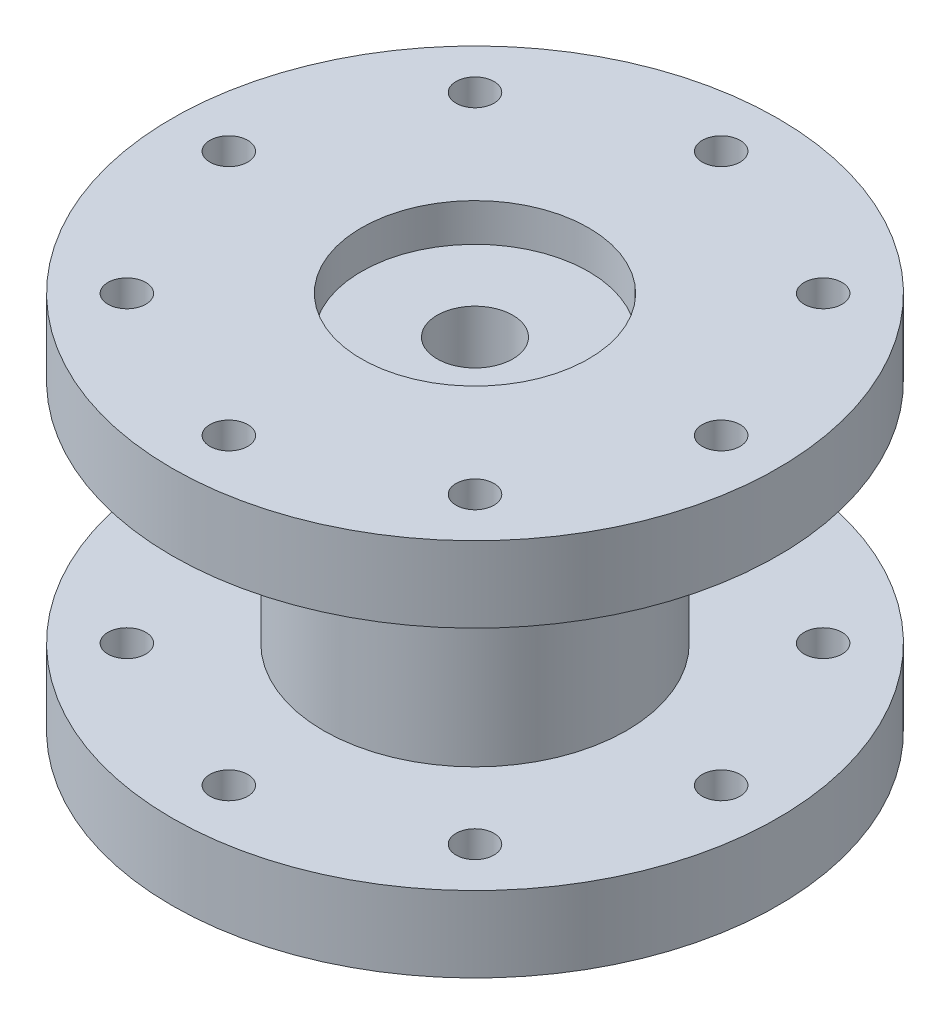
ISO-10303-21;
HEADER;
FILE_DESCRIPTION(('STEP AP214'),'2;1');
FILE_NAME('part.step','',(''),(''),'','','');
FILE_SCHEMA(('AUTOMOTIVE_DESIGN { 1 0 10303 214 1 1 1 1 }'));
ENDSEC;
DATA;
#1=APPLICATION_CONTEXT('core data for automotive mechanical design processes');
#2=APPLICATION_PROTOCOL_DEFINITION('international standard','automotive_design',2000,#1);
#3=PRODUCT_CONTEXT('',#1,'mechanical');
#4=PRODUCT('Part','Part','',(#3));
#5=PRODUCT_RELATED_PRODUCT_CATEGORY('part','',(#4));
#6=PRODUCT_DEFINITION_FORMATION('','',#4);
#7=PRODUCT_DEFINITION_CONTEXT('part definition',#1,'design');
#8=PRODUCT_DEFINITION('design','',#6,#7);
#9=PRODUCT_DEFINITION_SHAPE('','',#8);
#10=(LENGTH_UNIT() NAMED_UNIT(*) SI_UNIT(.MILLI.,.METRE.));
#11=(NAMED_UNIT(*) PLANE_ANGLE_UNIT() SI_UNIT($,.RADIAN.));
#12=(NAMED_UNIT(*) SI_UNIT($,.STERADIAN.) SOLID_ANGLE_UNIT());
#13=UNCERTAINTY_MEASURE_WITH_UNIT(LENGTH_MEASURE(1.E-05),#10,'distance_accuracy_value','');
#14=(GEOMETRIC_REPRESENTATION_CONTEXT(3) GLOBAL_UNCERTAINTY_ASSIGNED_CONTEXT((#13)) GLOBAL_UNIT_ASSIGNED_CONTEXT((#10,
#11,#12)) REPRESENTATION_CONTEXT('',''));
#15=CARTESIAN_POINT('',(0.,0.,0.));
#16=DIRECTION('',(0.,0.,1.));
#17=DIRECTION('',(1.,0.,0.));
#18=AXIS2_PLACEMENT_3D('',#15,#16,#17);
#19=CARTESIAN_POINT('',(0.,0.,0.));
#20=DIRECTION('',(0.,-1.,0.));
#21=DIRECTION('',(0.,0.,-1.));
#22=AXIS2_PLACEMENT_3D('',#19,#20,#21);
#23=CYLINDRICAL_SURFACE('',#22,19.05);
#24=CARTESIAN_POINT('',(0.,0.,0.));
#25=DIRECTION('',(0.,-1.,0.));
#26=DIRECTION('',(0.,0.,-1.));
#27=AXIS2_PLACEMENT_3D('',#24,#25,#26);
#28=CIRCLE('',#27,19.05);
#29=CARTESIAN_POINT('',(0.,0.,-19.05));
#30=VERTEX_POINT('',#29);
#31=EDGE_CURVE('E10',#30,#30,#28,.T.);
#32=ORIENTED_EDGE('',*,*,#31,.T.);
#33=EDGE_LOOP('',(#32));
#34=FACE_BOUND('',#33,.T.);
#35=CARTESIAN_POINT('',(0.,6.35,0.));
#36=DIRECTION('',(0.,-1.,0.));
#37=DIRECTION('',(0.,0.,-1.));
#38=AXIS2_PLACEMENT_3D('',#35,#36,#37);
#39=CIRCLE('',#38,19.05);
#40=CARTESIAN_POINT('',(0.,6.35,-19.05));
#41=VERTEX_POINT('',#40);
#42=EDGE_CURVE('E92',#41,#41,#39,.T.);
#43=ORIENTED_EDGE('',*,*,#42,.F.);
#44=EDGE_LOOP('',(#43));
#45=FACE_BOUND('',#44,.T.);
#46=ADVANCED_FACE('F41',(#34,#45),#23,.F.);
#47=CARTESIAN_POINT('',(19.05,0.,0.));
#48=DIRECTION('',(0.,-1.,0.));
#49=DIRECTION('',(0.,0.,-1.));
#50=AXIS2_PLACEMENT_3D('',#47,#48,#49);
#51=PLANE('',#50);
#52=CARTESIAN_POINT('',(41.275,0.,0.));
#53=DIRECTION('',(0.,1.,0.));
#54=DIRECTION('',(0.,0.,1.));
#55=AXIS2_PLACEMENT_3D('',#52,#53,#54);
#56=CIRCLE('',#55,3.175);
#57=CARTESIAN_POINT('',(41.275,0.,3.175));
#58=VERTEX_POINT('',#57);
#59=EDGE_CURVE('E160',#58,#58,#56,.T.);
#60=ORIENTED_EDGE('',*,*,#59,.T.);
#61=EDGE_LOOP('',(#60));
#62=FACE_BOUND('',#61,.T.);
#63=CARTESIAN_POINT('',(29.1858323934747,0.,29.1858323934748));
#64=DIRECTION('',(0.,1.,0.));
#65=DIRECTION('',(0.,0.,1.));
#66=AXIS2_PLACEMENT_3D('',#63,#64,#65);
#67=CIRCLE('',#66,3.175);
#68=CARTESIAN_POINT('',(29.1858323934747,0.,32.3608323934748));
#69=VERTEX_POINT('',#68);
#70=EDGE_CURVE('E209',#69,#69,#67,.T.);
#71=ORIENTED_EDGE('',*,*,#70,.T.);
#72=EDGE_LOOP('',(#71));
#73=FACE_BOUND('',#72,.T.);
#74=CARTESIAN_POINT('',(-1.4411089226075E-13,0.,41.275));
#75=DIRECTION('',(0.,1.,0.));
#76=DIRECTION('',(0.,0.,1.));
#77=AXIS2_PLACEMENT_3D('',#74,#75,#76);
#78=CIRCLE('',#77,3.17499999999999);
#79=CARTESIAN_POINT('',(-1.4411089226075E-13,0.,44.45));
#80=VERTEX_POINT('',#79);
#81=EDGE_CURVE('E201',#80,#80,#78,.T.);
#82=ORIENTED_EDGE('',*,*,#81,.T.);
#83=EDGE_LOOP('',(#82));
#84=FACE_BOUND('',#83,.T.);
#85=CARTESIAN_POINT('',(-29.1858323934749,0.,29.1858323934746));
#86=DIRECTION('',(0.,1.,0.));
#87=DIRECTION('',(0.,0.,1.));
#88=AXIS2_PLACEMENT_3D('',#85,#86,#87);
#89=CIRCLE('',#88,3.175);
#90=CARTESIAN_POINT('',(-29.1858323934749,0.,32.3608323934746));
#91=VERTEX_POINT('',#90);
#92=EDGE_CURVE('E193',#91,#91,#89,.T.);
#93=ORIENTED_EDGE('',*,*,#92,.T.);
#94=EDGE_LOOP('',(#93));
#95=FACE_BOUND('',#94,.T.);
#96=CARTESIAN_POINT('',(-41.275,0.,-2.88221784521501E-13));
#97=DIRECTION('',(0.,1.,0.));
#98=DIRECTION('',(0.,0.,1.));
#99=AXIS2_PLACEMENT_3D('',#96,#97,#98);
#100=CIRCLE('',#99,3.175);
#101=CARTESIAN_POINT('',(-41.275,0.,3.17499999999971));
#102=VERTEX_POINT('',#101);
#103=EDGE_CURVE('E185',#102,#102,#100,.T.);
#104=ORIENTED_EDGE('',*,*,#103,.T.);
#105=EDGE_LOOP('',(#104));
#106=FACE_BOUND('',#105,.T.);
#107=CARTESIAN_POINT('',(-29.1858323934745,0.,-29.185832393475));
#108=DIRECTION('',(0.,1.,0.));
#109=DIRECTION('',(0.,0.,1.));
#110=AXIS2_PLACEMENT_3D('',#107,#108,#109);
#111=CIRCLE('',#110,3.175);
#112=CARTESIAN_POINT('',(-29.1858323934745,0.,-26.010832393475));
#113=VERTEX_POINT('',#112);
#114=EDGE_CURVE('E177',#113,#113,#111,.T.);
#115=ORIENTED_EDGE('',*,*,#114,.T.);
#116=EDGE_LOOP('',(#115));
#117=FACE_BOUND('',#116,.T.);
#118=CARTESIAN_POINT('',(4.32332676782251E-13,0.,-41.275));
#119=DIRECTION('',(0.,1.,0.));
#120=DIRECTION('',(0.,0.,1.));
#121=AXIS2_PLACEMENT_3D('',#118,#119,#120);
#122=CIRCLE('',#121,3.17499999999999);
#123=CARTESIAN_POINT('',(4.32332676782251E-13,0.,-38.1));
#124=VERTEX_POINT('',#123);
#125=EDGE_CURVE('E169',#124,#124,#122,.T.);
#126=ORIENTED_EDGE('',*,*,#125,.T.);
#127=EDGE_LOOP('',(#126));
#128=FACE_BOUND('',#127,.T.);
#129=CARTESIAN_POINT('',(29.1858323934751,0.,-29.1858323934744));
#130=DIRECTION('',(0.,1.,0.));
#131=DIRECTION('',(0.,0.,1.));
#132=AXIS2_PLACEMENT_3D('',#129,#130,#131);
#133=CIRCLE('',#132,3.175);
#134=CARTESIAN_POINT('',(29.1858323934751,0.,-26.0108323934744));
#135=VERTEX_POINT('',#134);
#136=EDGE_CURVE('E161',#135,#135,#133,.T.);
#137=ORIENTED_EDGE('',*,*,#136,.T.);
#138=EDGE_LOOP('',(#137));
#139=FACE_BOUND('',#138,.T.);
#140=CARTESIAN_POINT('',(0.,0.,0.));
#141=DIRECTION('',(0.,-1.,0.));
#142=DIRECTION('',(0.,0.,-1.));
#143=AXIS2_PLACEMENT_3D('',#140,#141,#142);
#144=CIRCLE('',#143,50.8);
#145=CARTESIAN_POINT('',(0.,0.,-50.8));
#146=VERTEX_POINT('',#145);
#147=EDGE_CURVE('E48',#146,#146,#144,.T.);
#148=ORIENTED_EDGE('',*,*,#147,.T.);
#149=EDGE_LOOP('',(#148));
#150=FACE_BOUND('',#149,.T.);
#151=ORIENTED_EDGE('',*,*,#31,.F.);
#152=EDGE_LOOP('',(#151));
#153=FACE_BOUND('',#152,.T.);
#154=ADVANCED_FACE('F225',(#62,#73,#84,#95,#106,#117,#128,#139,#150,#153),#51,.T.);
#155=CARTESIAN_POINT('',(0.,0.,0.));
#156=DIRECTION('',(0.,-1.,0.));
#157=DIRECTION('',(0.,0.,-1.));
#158=AXIS2_PLACEMENT_3D('',#155,#156,#157);
#159=CYLINDRICAL_SURFACE('',#158,50.8);
#160=CARTESIAN_POINT('',(0.,12.7,0.));
#161=DIRECTION('',(0.,-1.,0.));
#162=DIRECTION('',(0.,0.,-1.));
#163=AXIS2_PLACEMENT_3D('',#160,#161,#162);
#164=CIRCLE('',#163,50.8);
#165=CARTESIAN_POINT('',(0.,12.7,-50.8));
#166=VERTEX_POINT('',#165);
#167=EDGE_CURVE('E53',#166,#166,#164,.T.);
#168=ORIENTED_EDGE('',*,*,#167,.T.);
#169=EDGE_LOOP('',(#168));
#170=FACE_BOUND('',#169,.T.);
#171=ORIENTED_EDGE('',*,*,#147,.F.);
#172=EDGE_LOOP('',(#171));
#173=FACE_BOUND('',#172,.T.);
#174=ADVANCED_FACE('F248',(#170,#173),#159,.T.);
#175=CARTESIAN_POINT('',(50.8,12.7,0.));
#176=DIRECTION('',(0.,1.,0.));
#177=DIRECTION('',(0.,0.,1.));
#178=AXIS2_PLACEMENT_3D('',#175,#176,#177);
#179=PLANE('',#178);
#180=CARTESIAN_POINT('',(41.275,12.7,0.));
#181=DIRECTION('',(0.,1.,0.));
#182=DIRECTION('',(0.,0.,1.));
#183=AXIS2_PLACEMENT_3D('',#180,#181,#182);
#184=CIRCLE('',#183,3.175);
#185=CARTESIAN_POINT('',(41.275,12.7,3.175));
#186=VERTEX_POINT('',#185);
#187=EDGE_CURVE('E96',#186,#186,#184,.T.);
#188=ORIENTED_EDGE('',*,*,#187,.F.);
#189=EDGE_LOOP('',(#188));
#190=FACE_BOUND('',#189,.T.);
#191=CARTESIAN_POINT('',(29.1858323934747,12.7,29.1858323934748));
#192=DIRECTION('',(0.,1.,0.));
#193=DIRECTION('',(0.,0.,1.));
#194=AXIS2_PLACEMENT_3D('',#191,#192,#193);
#195=CIRCLE('',#194,3.175);
#196=CARTESIAN_POINT('',(29.1858323934747,12.7,32.3608323934748));
#197=VERTEX_POINT('',#196);
#198=EDGE_CURVE('E104',#197,#197,#195,.T.);
#199=ORIENTED_EDGE('',*,*,#198,.F.);
#200=EDGE_LOOP('',(#199));
#201=FACE_BOUND('',#200,.T.);
#202=CARTESIAN_POINT('',(-1.4411089226075E-13,12.7,41.275));
#203=DIRECTION('',(0.,1.,0.));
#204=DIRECTION('',(0.,0.,1.));
#205=AXIS2_PLACEMENT_3D('',#202,#203,#204);
#206=CIRCLE('',#205,3.17499999999999);
#207=CARTESIAN_POINT('',(-1.4411089226075E-13,12.7,44.45));
#208=VERTEX_POINT('',#207);
#209=EDGE_CURVE('E112',#208,#208,#206,.T.);
#210=ORIENTED_EDGE('',*,*,#209,.F.);
#211=EDGE_LOOP('',(#210));
#212=FACE_BOUND('',#211,.T.);
#213=CARTESIAN_POINT('',(-29.1858323934749,12.7,29.1858323934746));
#214=DIRECTION('',(0.,1.,0.));
#215=DIRECTION('',(0.,0.,1.));
#216=AXIS2_PLACEMENT_3D('',#213,#214,#215);
#217=CIRCLE('',#216,3.175);
#218=CARTESIAN_POINT('',(-29.1858323934749,12.7,32.3608323934746));
#219=VERTEX_POINT('',#218);
#220=EDGE_CURVE('E120',#219,#219,#217,.T.);
#221=ORIENTED_EDGE('',*,*,#220,.F.);
#222=EDGE_LOOP('',(#221));
#223=FACE_BOUND('',#222,.T.);
#224=CARTESIAN_POINT('',(-41.275,12.7,-2.88221784521501E-13));
#225=DIRECTION('',(0.,1.,0.));
#226=DIRECTION('',(0.,0.,1.));
#227=AXIS2_PLACEMENT_3D('',#224,#225,#226);
#228=CIRCLE('',#227,3.175);
#229=CARTESIAN_POINT('',(-41.275,12.7,3.17499999999971));
#230=VERTEX_POINT('',#229);
#231=EDGE_CURVE('E128',#230,#230,#228,.T.);
#232=ORIENTED_EDGE('',*,*,#231,.F.);
#233=EDGE_LOOP('',(#232));
#234=FACE_BOUND('',#233,.T.);
#235=CARTESIAN_POINT('',(-29.1858323934745,12.7,-29.185832393475));
#236=DIRECTION('',(0.,1.,0.));
#237=DIRECTION('',(0.,0.,1.));
#238=AXIS2_PLACEMENT_3D('',#235,#236,#237);
#239=CIRCLE('',#238,3.175);
#240=CARTESIAN_POINT('',(-29.1858323934745,12.7,-26.010832393475));
#241=VERTEX_POINT('',#240);
#242=EDGE_CURVE('E136',#241,#241,#239,.T.);
#243=ORIENTED_EDGE('',*,*,#242,.F.);
#244=EDGE_LOOP('',(#243));
#245=FACE_BOUND('',#244,.T.);
#246=CARTESIAN_POINT('',(4.32332676782251E-13,12.7,-41.275));
#247=DIRECTION('',(0.,1.,0.));
#248=DIRECTION('',(0.,0.,1.));
#249=AXIS2_PLACEMENT_3D('',#246,#247,#248);
#250=CIRCLE('',#249,3.17499999999999);
#251=CARTESIAN_POINT('',(4.32332676782251E-13,12.7,-38.1));
#252=VERTEX_POINT('',#251);
#253=EDGE_CURVE('E144',#252,#252,#250,.T.);
#254=ORIENTED_EDGE('',*,*,#253,.F.);
#255=EDGE_LOOP('',(#254));
#256=FACE_BOUND('',#255,.T.);
#257=CARTESIAN_POINT('',(29.1858323934751,12.7,-29.1858323934744));
#258=DIRECTION('',(0.,1.,0.));
#259=DIRECTION('',(0.,0.,1.));
#260=AXIS2_PLACEMENT_3D('',#257,#258,#259);
#261=CIRCLE('',#260,3.175);
#262=CARTESIAN_POINT('',(29.1858323934751,12.7,-26.0108323934744));
#263=VERTEX_POINT('',#262);
#264=EDGE_CURVE('E152',#263,#263,#261,.T.);
#265=ORIENTED_EDGE('',*,*,#264,.F.);
#266=EDGE_LOOP('',(#265));
#267=FACE_BOUND('',#266,.T.);
#268=CARTESIAN_POINT('',(0.,12.7,0.));
#269=DIRECTION('',(0.,-1.,0.));
#270=DIRECTION('',(0.,0.,-1.));
#271=AXIS2_PLACEMENT_3D('',#268,#269,#270);
#272=CIRCLE('',#271,25.4);
#273=CARTESIAN_POINT('',(0.,12.7,-25.4));
#274=VERTEX_POINT('',#273);
#275=EDGE_CURVE('E58',#274,#274,#272,.T.);
#276=ORIENTED_EDGE('',*,*,#275,.T.);
#277=EDGE_LOOP('',(#276));
#278=FACE_BOUND('',#277,.T.);
#279=ORIENTED_EDGE('',*,*,#167,.F.);
#280=EDGE_LOOP('',(#279));
#281=FACE_BOUND('',#280,.T.);
#282=ADVANCED_FACE('F300',(#190,#201,#212,#223,#234,#245,#256,#267,#278,#281),#179,.T.);
#283=CARTESIAN_POINT('',(0.,0.,0.));
#284=DIRECTION('',(0.,-1.,0.));
#285=DIRECTION('',(0.,0.,-1.));
#286=AXIS2_PLACEMENT_3D('',#283,#284,#285);
#287=CYLINDRICAL_SURFACE('',#286,25.4);
#288=CARTESIAN_POINT('',(0.,50.8,0.));
#289=DIRECTION('',(0.,-1.,0.));
#290=DIRECTION('',(0.,0.,-1.));
#291=AXIS2_PLACEMENT_3D('',#288,#289,#290);
#292=CIRCLE('',#291,25.4);
#293=CARTESIAN_POINT('',(0.,50.8,-25.4));
#294=VERTEX_POINT('',#293);
#295=EDGE_CURVE('E64',#294,#294,#292,.T.);
#296=ORIENTED_EDGE('',*,*,#295,.T.);
#297=EDGE_LOOP('',(#296));
#298=FACE_BOUND('',#297,.T.);
#299=ORIENTED_EDGE('',*,*,#275,.F.);
#300=EDGE_LOOP('',(#299));
#301=FACE_BOUND('',#300,.T.);
#302=ADVANCED_FACE('F293',(#298,#301),#287,.T.);
#303=CARTESIAN_POINT('',(25.4,50.8,0.));
#304=DIRECTION('',(0.,-1.,0.));
#305=DIRECTION('',(0.,0.,-1.));
#306=AXIS2_PLACEMENT_3D('',#303,#304,#305);
#307=PLANE('',#306);
#308=CARTESIAN_POINT('',(41.275,50.8,0.));
#309=DIRECTION('',(0.,-1.,0.));
#310=DIRECTION('',(0.,0.,-1.));
#311=AXIS2_PLACEMENT_3D('',#308,#309,#310);
#312=CIRCLE('',#311,3.175);
#313=CARTESIAN_POINT('',(41.275,50.8,-3.175));
#314=VERTEX_POINT('',#313);
#315=EDGE_CURVE('E100',#314,#314,#312,.T.);
#316=ORIENTED_EDGE('',*,*,#315,.F.);
#317=EDGE_LOOP('',(#316));
#318=FACE_BOUND('',#317,.T.);
#319=CARTESIAN_POINT('',(29.1858323934747,50.8,29.1858323934748));
#320=DIRECTION('',(0.,-1.,0.));
#321=DIRECTION('',(0.,0.,-1.));
#322=AXIS2_PLACEMENT_3D('',#319,#320,#321);
#323=CIRCLE('',#322,3.175);
#324=CARTESIAN_POINT('',(29.1858323934747,50.8,26.0108323934748));
#325=VERTEX_POINT('',#324);
#326=EDGE_CURVE('E108',#325,#325,#323,.T.);
#327=ORIENTED_EDGE('',*,*,#326,.F.);
#328=EDGE_LOOP('',(#327));
#329=FACE_BOUND('',#328,.T.);
#330=CARTESIAN_POINT('',(-1.4411089226075E-13,50.8,41.275));
#331=DIRECTION('',(0.,-1.,0.));
#332=DIRECTION('',(0.,0.,-1.));
#333=AXIS2_PLACEMENT_3D('',#330,#331,#332);
#334=CIRCLE('',#333,3.17499999999999);
#335=CARTESIAN_POINT('',(-1.4411089226075E-13,50.8,38.1));
#336=VERTEX_POINT('',#335);
#337=EDGE_CURVE('E116',#336,#336,#334,.T.);
#338=ORIENTED_EDGE('',*,*,#337,.F.);
#339=EDGE_LOOP('',(#338));
#340=FACE_BOUND('',#339,.T.);
#341=CARTESIAN_POINT('',(-29.1858323934749,50.8,29.1858323934746));
#342=DIRECTION('',(0.,-1.,0.));
#343=DIRECTION('',(0.,0.,-1.));
#344=AXIS2_PLACEMENT_3D('',#341,#342,#343);
#345=CIRCLE('',#344,3.175);
#346=CARTESIAN_POINT('',(-29.1858323934749,50.8,26.0108323934746));
#347=VERTEX_POINT('',#346);
#348=EDGE_CURVE('E124',#347,#347,#345,.T.);
#349=ORIENTED_EDGE('',*,*,#348,.F.);
#350=EDGE_LOOP('',(#349));
#351=FACE_BOUND('',#350,.T.);
#352=CARTESIAN_POINT('',(-41.275,50.8,-2.88221784521501E-13));
#353=DIRECTION('',(0.,-1.,0.));
#354=DIRECTION('',(0.,0.,-1.));
#355=AXIS2_PLACEMENT_3D('',#352,#353,#354);
#356=CIRCLE('',#355,3.175);
#357=CARTESIAN_POINT('',(-41.275,50.8,-3.17500000000029));
#358=VERTEX_POINT('',#357);
#359=EDGE_CURVE('E132',#358,#358,#356,.T.);
#360=ORIENTED_EDGE('',*,*,#359,.F.);
#361=EDGE_LOOP('',(#360));
#362=FACE_BOUND('',#361,.T.);
#363=CARTESIAN_POINT('',(-29.1858323934745,50.8,-29.185832393475));
#364=DIRECTION('',(0.,-1.,0.));
#365=DIRECTION('',(0.,0.,-1.));
#366=AXIS2_PLACEMENT_3D('',#363,#364,#365);
#367=CIRCLE('',#366,3.175);
#368=CARTESIAN_POINT('',(-29.1858323934745,50.8,-32.360832393475));
#369=VERTEX_POINT('',#368);
#370=EDGE_CURVE('E140',#369,#369,#367,.T.);
#371=ORIENTED_EDGE('',*,*,#370,.F.);
#372=EDGE_LOOP('',(#371));
#373=FACE_BOUND('',#372,.T.);
#374=CARTESIAN_POINT('',(4.32332676782251E-13,50.8,-41.275));
#375=DIRECTION('',(0.,-1.,0.));
#376=DIRECTION('',(0.,0.,-1.));
#377=AXIS2_PLACEMENT_3D('',#374,#375,#376);
#378=CIRCLE('',#377,3.17499999999999);
#379=CARTESIAN_POINT('',(4.32332676782251E-13,50.8,-44.45));
#380=VERTEX_POINT('',#379);
#381=EDGE_CURVE('E148',#380,#380,#378,.T.);
#382=ORIENTED_EDGE('',*,*,#381,.F.);
#383=EDGE_LOOP('',(#382));
#384=FACE_BOUND('',#383,.T.);
#385=CARTESIAN_POINT('',(29.1858323934751,50.8,-29.1858323934744));
#386=DIRECTION('',(0.,-1.,0.));
#387=DIRECTION('',(0.,0.,-1.));
#388=AXIS2_PLACEMENT_3D('',#385,#386,#387);
#389=CIRCLE('',#388,3.175);
#390=CARTESIAN_POINT('',(29.1858323934751,50.8,-32.3608323934744));
#391=VERTEX_POINT('',#390);
#392=EDGE_CURVE('E156',#391,#391,#389,.T.);
#393=ORIENTED_EDGE('',*,*,#392,.F.);
#394=EDGE_LOOP('',(#393));
#395=FACE_BOUND('',#394,.T.);
#396=CARTESIAN_POINT('',(0.,50.8,0.));
#397=DIRECTION('',(0.,-1.,0.));
#398=DIRECTION('',(0.,0.,-1.));
#399=AXIS2_PLACEMENT_3D('',#396,#397,#398);
#400=CIRCLE('',#399,50.8);
#401=CARTESIAN_POINT('',(0.,50.8,-50.8));
#402=VERTEX_POINT('',#401);
#403=EDGE_CURVE('E68',#402,#402,#400,.T.);
#404=ORIENTED_EDGE('',*,*,#403,.T.);
#405=EDGE_LOOP('',(#404));
#406=FACE_BOUND('',#405,.T.);
#407=ORIENTED_EDGE('',*,*,#295,.F.);
#408=EDGE_LOOP('',(#407));
#409=FACE_BOUND('',#408,.T.);
#410=ADVANCED_FACE('F287',(#318,#329,#340,#351,#362,#373,#384,#395,#406,#409),#307,.T.);
#411=CARTESIAN_POINT('',(0.,0.,0.));
#412=DIRECTION('',(0.,-1.,0.));
#413=DIRECTION('',(0.,0.,-1.));
#414=AXIS2_PLACEMENT_3D('',#411,#412,#413);
#415=CYLINDRICAL_SURFACE('',#414,50.8);
#416=CARTESIAN_POINT('',(0.,63.5,0.));
#417=DIRECTION('',(0.,-1.,0.));
#418=DIRECTION('',(0.,0.,-1.));
#419=AXIS2_PLACEMENT_3D('',#416,#417,#418);
#420=CIRCLE('',#419,50.8);
#421=CARTESIAN_POINT('',(0.,63.5,-50.8));
#422=VERTEX_POINT('',#421);
#423=EDGE_CURVE('E72',#422,#422,#420,.T.);
#424=ORIENTED_EDGE('',*,*,#423,.T.);
#425=EDGE_LOOP('',(#424));
#426=FACE_BOUND('',#425,.T.);
#427=ORIENTED_EDGE('',*,*,#403,.F.);
#428=EDGE_LOOP('',(#427));
#429=FACE_BOUND('',#428,.T.);
#430=ADVANCED_FACE('F280',(#426,#429),#415,.T.);
#431=CARTESIAN_POINT('',(50.8,63.5,0.));
#432=DIRECTION('',(0.,1.,0.));
#433=DIRECTION('',(0.,0.,1.));
#434=AXIS2_PLACEMENT_3D('',#431,#432,#433);
#435=PLANE('',#434);
#436=CARTESIAN_POINT('',(41.275,63.5,0.));
#437=DIRECTION('',(0.,1.,0.));
#438=DIRECTION('',(0.,0.,1.));
#439=AXIS2_PLACEMENT_3D('',#436,#437,#438);
#440=CIRCLE('',#439,3.175);
#441=CARTESIAN_POINT('',(41.275,63.5,3.175));
#442=VERTEX_POINT('',#441);
#443=EDGE_CURVE('E217',#442,#442,#440,.T.);
#444=ORIENTED_EDGE('',*,*,#443,.F.);
#445=EDGE_LOOP('',(#444));
#446=FACE_BOUND('',#445,.T.);
#447=CARTESIAN_POINT('',(29.1858323934747,63.5,29.1858323934748));
#448=DIRECTION('',(0.,1.,0.));
#449=DIRECTION('',(0.,0.,1.));
#450=AXIS2_PLACEMENT_3D('',#447,#448,#449);
#451=CIRCLE('',#450,3.175);
#452=CARTESIAN_POINT('',(29.1858323934747,63.5,32.3608323934748));
#453=VERTEX_POINT('',#452);
#454=EDGE_CURVE('E213',#453,#453,#451,.T.);
#455=ORIENTED_EDGE('',*,*,#454,.F.);
#456=EDGE_LOOP('',(#455));
#457=FACE_BOUND('',#456,.T.);
#458=CARTESIAN_POINT('',(-1.4411089226075E-13,63.5,41.275));
#459=DIRECTION('',(0.,1.,0.));
#460=DIRECTION('',(0.,0.,1.));
#461=AXIS2_PLACEMENT_3D('',#458,#459,#460);
#462=CIRCLE('',#461,3.17499999999999);
#463=CARTESIAN_POINT('',(-1.4411089226075E-13,63.5,44.45));
#464=VERTEX_POINT('',#463);
#465=EDGE_CURVE('E205',#464,#464,#462,.T.);
#466=ORIENTED_EDGE('',*,*,#465,.F.);
#467=EDGE_LOOP('',(#466));
#468=FACE_BOUND('',#467,.T.);
#469=CARTESIAN_POINT('',(-29.1858323934749,63.5,29.1858323934746));
#470=DIRECTION('',(0.,1.,0.));
#471=DIRECTION('',(0.,0.,1.));
#472=AXIS2_PLACEMENT_3D('',#469,#470,#471);
#473=CIRCLE('',#472,3.175);
#474=CARTESIAN_POINT('',(-29.1858323934749,63.5,32.3608323934746));
#475=VERTEX_POINT('',#474);
#476=EDGE_CURVE('E197',#475,#475,#473,.T.);
#477=ORIENTED_EDGE('',*,*,#476,.F.);
#478=EDGE_LOOP('',(#477));
#479=FACE_BOUND('',#478,.T.);
#480=CARTESIAN_POINT('',(-41.275,63.5,-2.88221784521501E-13));
#481=DIRECTION('',(0.,1.,0.));
#482=DIRECTION('',(0.,0.,1.));
#483=AXIS2_PLACEMENT_3D('',#480,#481,#482);
#484=CIRCLE('',#483,3.175);
#485=CARTESIAN_POINT('',(-41.275,63.5,3.17499999999971));
#486=VERTEX_POINT('',#485);
#487=EDGE_CURVE('E189',#486,#486,#484,.T.);
#488=ORIENTED_EDGE('',*,*,#487,.F.);
#489=EDGE_LOOP('',(#488));
#490=FACE_BOUND('',#489,.T.);
#491=CARTESIAN_POINT('',(-29.1858323934745,63.5,-29.185832393475));
#492=DIRECTION('',(0.,1.,0.));
#493=DIRECTION('',(0.,0.,1.));
#494=AXIS2_PLACEMENT_3D('',#491,#492,#493);
#495=CIRCLE('',#494,3.175);
#496=CARTESIAN_POINT('',(-29.1858323934745,63.5,-26.010832393475));
#497=VERTEX_POINT('',#496);
#498=EDGE_CURVE('E181',#497,#497,#495,.T.);
#499=ORIENTED_EDGE('',*,*,#498,.F.);
#500=EDGE_LOOP('',(#499));
#501=FACE_BOUND('',#500,.T.);
#502=CARTESIAN_POINT('',(4.32332676782251E-13,63.5,-41.275));
#503=DIRECTION('',(0.,1.,0.));
#504=DIRECTION('',(0.,0.,1.));
#505=AXIS2_PLACEMENT_3D('',#502,#503,#504);
#506=CIRCLE('',#505,3.17499999999999);
#507=CARTESIAN_POINT('',(4.32332676782251E-13,63.5,-38.1));
#508=VERTEX_POINT('',#507);
#509=EDGE_CURVE('E173',#508,#508,#506,.T.);
#510=ORIENTED_EDGE('',*,*,#509,.F.);
#511=EDGE_LOOP('',(#510));
#512=FACE_BOUND('',#511,.T.);
#513=CARTESIAN_POINT('',(29.1858323934751,63.5,-29.1858323934744));
#514=DIRECTION('',(0.,1.,0.));
#515=DIRECTION('',(0.,0.,1.));
#516=AXIS2_PLACEMENT_3D('',#513,#514,#515);
#517=CIRCLE('',#516,3.175);
#518=CARTESIAN_POINT('',(29.1858323934751,63.5,-26.0108323934744));
#519=VERTEX_POINT('',#518);
#520=EDGE_CURVE('E165',#519,#519,#517,.T.);
#521=ORIENTED_EDGE('',*,*,#520,.F.);
#522=EDGE_LOOP('',(#521));
#523=FACE_BOUND('',#522,.T.);
#524=CARTESIAN_POINT('',(0.,63.5,0.));
#525=DIRECTION('',(0.,-1.,0.));
#526=DIRECTION('',(0.,0.,-1.));
#527=AXIS2_PLACEMENT_3D('',#524,#525,#526);
#528=CIRCLE('',#527,19.05);
#529=CARTESIAN_POINT('',(0.,63.5,-19.05));
#530=VERTEX_POINT('',#529);
#531=EDGE_CURVE('E76',#530,#530,#528,.T.);
#532=ORIENTED_EDGE('',*,*,#531,.T.);
#533=EDGE_LOOP('',(#532));
#534=FACE_BOUND('',#533,.T.);
#535=ORIENTED_EDGE('',*,*,#423,.F.);
#536=EDGE_LOOP('',(#535));
#537=FACE_BOUND('',#536,.T.);
#538=ADVANCED_FACE('F274',(#446,#457,#468,#479,#490,#501,#512,#523,#534,#537),#435,.T.);
#539=CARTESIAN_POINT('',(0.,0.,0.));
#540=DIRECTION('',(0.,-1.,0.));
#541=DIRECTION('',(0.,0.,-1.));
#542=AXIS2_PLACEMENT_3D('',#539,#540,#541);
#543=CYLINDRICAL_SURFACE('',#542,19.05);
#544=CARTESIAN_POINT('',(0.,57.15,0.));
#545=DIRECTION('',(0.,-1.,0.));
#546=DIRECTION('',(0.,0.,-1.));
#547=AXIS2_PLACEMENT_3D('',#544,#545,#546);
#548=CIRCLE('',#547,19.05);
#549=CARTESIAN_POINT('',(0.,57.15,-19.05));
#550=VERTEX_POINT('',#549);
#551=EDGE_CURVE('E80',#550,#550,#548,.T.);
#552=ORIENTED_EDGE('',*,*,#551,.T.);
#553=EDGE_LOOP('',(#552));
#554=FACE_BOUND('',#553,.T.);
#555=ORIENTED_EDGE('',*,*,#531,.F.);
#556=EDGE_LOOP('',(#555));
#557=FACE_BOUND('',#556,.T.);
#558=ADVANCED_FACE('F268',(#554,#557),#543,.F.);
#559=CARTESIAN_POINT('',(19.05,57.15,0.));
#560=DIRECTION('',(0.,1.,0.));
#561=DIRECTION('',(0.,0.,1.));
#562=AXIS2_PLACEMENT_3D('',#559,#560,#561);
#563=PLANE('',#562);
#564=CARTESIAN_POINT('',(0.,57.15,0.));
#565=DIRECTION('',(0.,-1.,0.));
#566=DIRECTION('',(0.,0.,-1.));
#567=AXIS2_PLACEMENT_3D('',#564,#565,#566);
#568=CIRCLE('',#567,6.35);
#569=CARTESIAN_POINT('',(0.,57.15,-6.35));
#570=VERTEX_POINT('',#569);
#571=EDGE_CURVE('E84',#570,#570,#568,.T.);
#572=ORIENTED_EDGE('',*,*,#571,.T.);
#573=EDGE_LOOP('',(#572));
#574=FACE_BOUND('',#573,.T.);
#575=ORIENTED_EDGE('',*,*,#551,.F.);
#576=EDGE_LOOP('',(#575));
#577=FACE_BOUND('',#576,.T.);
#578=ADVANCED_FACE('F262',(#574,#577),#563,.T.);
#579=CARTESIAN_POINT('',(0.,0.,0.));
#580=DIRECTION('',(0.,-1.,0.));
#581=DIRECTION('',(0.,0.,-1.));
#582=AXIS2_PLACEMENT_3D('',#579,#580,#581);
#583=CYLINDRICAL_SURFACE('',#582,6.35);
#584=CARTESIAN_POINT('',(0.,6.35,0.));
#585=DIRECTION('',(0.,-1.,0.));
#586=DIRECTION('',(0.,0.,-1.));
#587=AXIS2_PLACEMENT_3D('',#584,#585,#586);
#588=CIRCLE('',#587,6.35000000000001);
#589=CARTESIAN_POINT('',(0.,6.35,-6.35000000000001));
#590=VERTEX_POINT('',#589);
#591=EDGE_CURVE('E88',#590,#590,#588,.T.);
#592=ORIENTED_EDGE('',*,*,#591,.T.);
#593=EDGE_LOOP('',(#592));
#594=FACE_BOUND('',#593,.T.);
#595=ORIENTED_EDGE('',*,*,#571,.F.);
#596=EDGE_LOOP('',(#595));
#597=FACE_BOUND('',#596,.T.);
#598=ADVANCED_FACE('F256',(#594,#597),#583,.F.);
#599=CARTESIAN_POINT('',(6.35000000000001,6.35,0.));
#600=DIRECTION('',(0.,-1.,0.));
#601=DIRECTION('',(0.,0.,-1.));
#602=AXIS2_PLACEMENT_3D('',#599,#600,#601);
#603=PLANE('',#602);
#604=ORIENTED_EDGE('',*,*,#42,.T.);
#605=EDGE_LOOP('',(#604));
#606=FACE_BOUND('',#605,.T.);
#607=ORIENTED_EDGE('',*,*,#591,.F.);
#608=EDGE_LOOP('',(#607));
#609=FACE_BOUND('',#608,.T.);
#610=ADVANCED_FACE('F252',(#606,#609),#603,.T.);
#611=CARTESIAN_POINT('',(29.1858323934751,0.,-29.1858323934744));
#612=DIRECTION('',(0.,1.,0.));
#613=DIRECTION('',(0.,0.,1.));
#614=AXIS2_PLACEMENT_3D('',#611,#612,#613);
#615=CYLINDRICAL_SURFACE('',#614,3.175);
#616=ORIENTED_EDGE('',*,*,#392,.T.);
#617=EDGE_LOOP('',(#616));
#618=FACE_BOUND('',#617,.T.);
#619=ORIENTED_EDGE('',*,*,#520,.T.);
#620=EDGE_LOOP('',(#619));
#621=FACE_BOUND('',#620,.T.);
#622=ADVANCED_FACE('F255',(#618,#621),#615,.F.);
#623=CARTESIAN_POINT('',(4.32332676782251E-13,0.,-41.275));
#624=DIRECTION('',(0.,1.,0.));
#625=DIRECTION('',(0.,0.,1.));
#626=AXIS2_PLACEMENT_3D('',#623,#624,#625);
#627=CYLINDRICAL_SURFACE('',#626,3.17499999999999);
#628=ORIENTED_EDGE('',*,*,#381,.T.);
#629=EDGE_LOOP('',(#628));
#630=FACE_BOUND('',#629,.T.);
#631=ORIENTED_EDGE('',*,*,#509,.T.);
#632=EDGE_LOOP('',(#631));
#633=FACE_BOUND('',#632,.T.);
#634=ADVANCED_FACE('F318',(#630,#633),#627,.F.);
#635=CARTESIAN_POINT('',(-29.1858323934745,0.,-29.185832393475));
#636=DIRECTION('',(0.,1.,0.));
#637=DIRECTION('',(0.,0.,1.));
#638=AXIS2_PLACEMENT_3D('',#635,#636,#637);
#639=CYLINDRICAL_SURFACE('',#638,3.175);
#640=ORIENTED_EDGE('',*,*,#370,.T.);
#641=EDGE_LOOP('',(#640));
#642=FACE_BOUND('',#641,.T.);
#643=ORIENTED_EDGE('',*,*,#498,.T.);
#644=EDGE_LOOP('',(#643));
#645=FACE_BOUND('',#644,.T.);
#646=ADVANCED_FACE('F322',(#642,#645),#639,.F.);
#647=CARTESIAN_POINT('',(-41.275,0.,-2.88221784521501E-13));
#648=DIRECTION('',(0.,1.,0.));
#649=DIRECTION('',(0.,0.,1.));
#650=AXIS2_PLACEMENT_3D('',#647,#648,#649);
#651=CYLINDRICAL_SURFACE('',#650,3.175);
#652=ORIENTED_EDGE('',*,*,#359,.T.);
#653=EDGE_LOOP('',(#652));
#654=FACE_BOUND('',#653,.T.);
#655=ORIENTED_EDGE('',*,*,#487,.T.);
#656=EDGE_LOOP('',(#655));
#657=FACE_BOUND('',#656,.T.);
#658=ADVANCED_FACE('F327',(#654,#657),#651,.F.);
#659=CARTESIAN_POINT('',(-29.1858323934749,0.,29.1858323934746));
#660=DIRECTION('',(0.,1.,0.));
#661=DIRECTION('',(0.,0.,1.));
#662=AXIS2_PLACEMENT_3D('',#659,#660,#661);
#663=CYLINDRICAL_SURFACE('',#662,3.175);
#664=ORIENTED_EDGE('',*,*,#348,.T.);
#665=EDGE_LOOP('',(#664));
#666=FACE_BOUND('',#665,.T.);
#667=ORIENTED_EDGE('',*,*,#476,.T.);
#668=EDGE_LOOP('',(#667));
#669=FACE_BOUND('',#668,.T.);
#670=ADVANCED_FACE('F332',(#666,#669),#663,.F.);
#671=CARTESIAN_POINT('',(-1.4411089226075E-13,0.,41.275));
#672=DIRECTION('',(0.,1.,0.));
#673=DIRECTION('',(0.,0.,1.));
#674=AXIS2_PLACEMENT_3D('',#671,#672,#673);
#675=CYLINDRICAL_SURFACE('',#674,3.17499999999999);
#676=ORIENTED_EDGE('',*,*,#337,.T.);
#677=EDGE_LOOP('',(#676));
#678=FACE_BOUND('',#677,.T.);
#679=ORIENTED_EDGE('',*,*,#465,.T.);
#680=EDGE_LOOP('',(#679));
#681=FACE_BOUND('',#680,.T.);
#682=ADVANCED_FACE('F337',(#678,#681),#675,.F.);
#683=CARTESIAN_POINT('',(29.1858323934747,0.,29.1858323934748));
#684=DIRECTION('',(0.,1.,0.));
#685=DIRECTION('',(0.,0.,1.));
#686=AXIS2_PLACEMENT_3D('',#683,#684,#685);
#687=CYLINDRICAL_SURFACE('',#686,3.175);
#688=ORIENTED_EDGE('',*,*,#326,.T.);
#689=EDGE_LOOP('',(#688));
#690=FACE_BOUND('',#689,.T.);
#691=ORIENTED_EDGE('',*,*,#454,.T.);
#692=EDGE_LOOP('',(#691));
#693=FACE_BOUND('',#692,.T.);
#694=ADVANCED_FACE('F240',(#690,#693),#687,.F.);
#695=CARTESIAN_POINT('',(41.275,0.,0.));
#696=DIRECTION('',(0.,1.,0.));
#697=DIRECTION('',(0.,0.,1.));
#698=AXIS2_PLACEMENT_3D('',#695,#696,#697);
#699=CYLINDRICAL_SURFACE('',#698,3.175);
#700=ORIENTED_EDGE('',*,*,#315,.T.);
#701=EDGE_LOOP('',(#700));
#702=FACE_BOUND('',#701,.T.);
#703=ORIENTED_EDGE('',*,*,#443,.T.);
#704=EDGE_LOOP('',(#703));
#705=FACE_BOUND('',#704,.T.);
#706=ADVANCED_FACE('F233',(#702,#705),#699,.F.);
#707=ORIENTED_EDGE('',*,*,#264,.T.);
#708=EDGE_LOOP('',(#707));
#709=FACE_BOUND('',#708,.T.);
#710=ORIENTED_EDGE('',*,*,#136,.F.);
#711=EDGE_LOOP('',(#710));
#712=FACE_BOUND('',#711,.T.);
#713=ADVANCED_FACE('F242',(#709,#712),#615,.F.);
#714=ORIENTED_EDGE('',*,*,#253,.T.);
#715=EDGE_LOOP('',(#714));
#716=FACE_BOUND('',#715,.T.);
#717=ORIENTED_EDGE('',*,*,#125,.F.);
#718=EDGE_LOOP('',(#717));
#719=FACE_BOUND('',#718,.T.);
#720=ADVANCED_FACE('F324',(#716,#719),#627,.F.);
#721=ORIENTED_EDGE('',*,*,#242,.T.);
#722=EDGE_LOOP('',(#721));
#723=FACE_BOUND('',#722,.T.);
#724=ORIENTED_EDGE('',*,*,#114,.F.);
#725=EDGE_LOOP('',(#724));
#726=FACE_BOUND('',#725,.T.);
#727=ADVANCED_FACE('F329',(#723,#726),#639,.F.);
#728=ORIENTED_EDGE('',*,*,#231,.T.);
#729=EDGE_LOOP('',(#728));
#730=FACE_BOUND('',#729,.T.);
#731=ORIENTED_EDGE('',*,*,#103,.F.);
#732=EDGE_LOOP('',(#731));
#733=FACE_BOUND('',#732,.T.);
#734=ADVANCED_FACE('F334',(#730,#733),#651,.F.);
#735=ORIENTED_EDGE('',*,*,#220,.T.);
#736=EDGE_LOOP('',(#735));
#737=FACE_BOUND('',#736,.T.);
#738=ORIENTED_EDGE('',*,*,#92,.F.);
#739=EDGE_LOOP('',(#738));
#740=FACE_BOUND('',#739,.T.);
#741=ADVANCED_FACE('F339',(#737,#740),#663,.F.);
#742=ORIENTED_EDGE('',*,*,#209,.T.);
#743=EDGE_LOOP('',(#742));
#744=FACE_BOUND('',#743,.T.);
#745=ORIENTED_EDGE('',*,*,#81,.F.);
#746=EDGE_LOOP('',(#745));
#747=FACE_BOUND('',#746,.T.);
#748=ADVANCED_FACE('F237',(#744,#747),#675,.F.);
#749=ORIENTED_EDGE('',*,*,#198,.T.);
#750=EDGE_LOOP('',(#749));
#751=FACE_BOUND('',#750,.T.);
#752=ORIENTED_EDGE('',*,*,#70,.F.);
#753=EDGE_LOOP('',(#752));
#754=FACE_BOUND('',#753,.T.);
#755=ADVANCED_FACE('F230',(#751,#754),#687,.F.);
#756=ORIENTED_EDGE('',*,*,#187,.T.);
#757=EDGE_LOOP('',(#756));
#758=FACE_BOUND('',#757,.T.);
#759=ORIENTED_EDGE('',*,*,#59,.F.);
#760=EDGE_LOOP('',(#759));
#761=FACE_BOUND('',#760,.T.);
#762=ADVANCED_FACE('F228',(#758,#761),#699,.F.);
#763=CLOSED_SHELL('',(#46,#154,#174,#282,#302,#410,#430,#538,#558,#578,#598,#610,#622,#634,#646,
#658,#670,#682,#694,#706,#713,#720,#727,#734,#741,#748,#755,#762));
#764=MANIFOLD_SOLID_BREP('B2',#763);
#765=ADVANCED_BREP_SHAPE_REPRESENTATION('',(#18,#764),#14);
#766=SHAPE_DEFINITION_REPRESENTATION(#9,#765);
ENDSEC;
END-ISO-10303-21;
